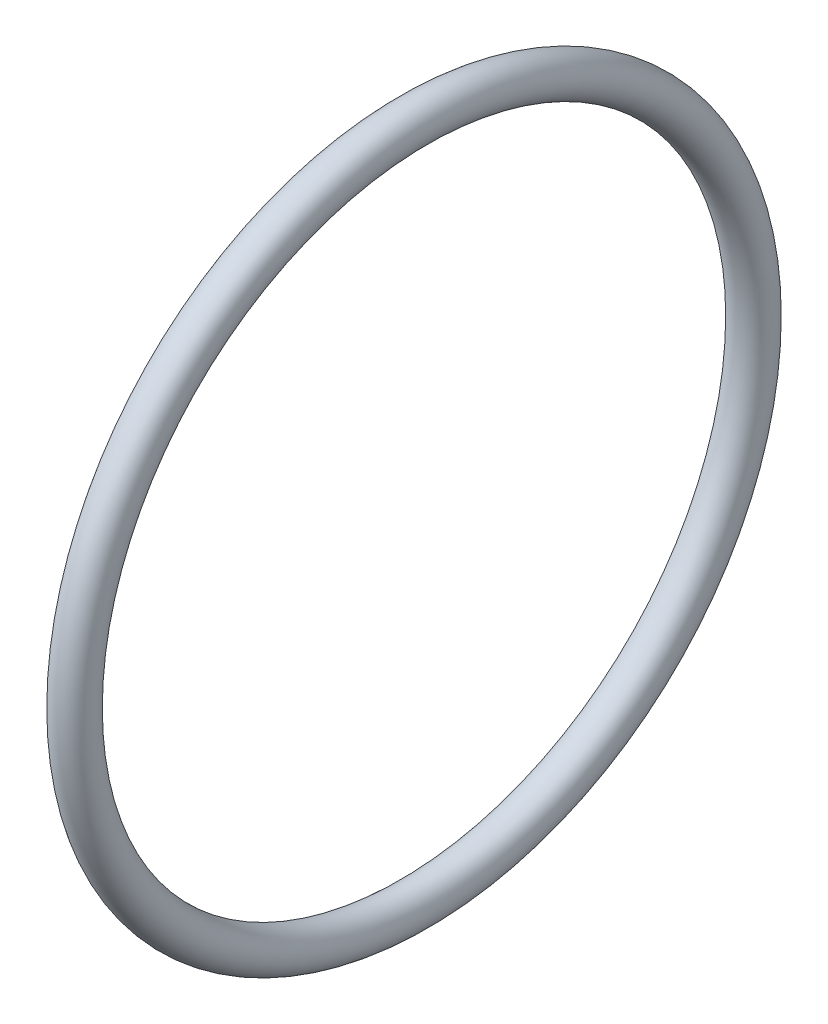
ISO-10303-21;
HEADER;
FILE_DESCRIPTION(('STEP AP214'),'2;1');
FILE_NAME('part.step','',(''),(''),'','','');
FILE_SCHEMA(('AUTOMOTIVE_DESIGN { 1 0 10303 214 1 1 1 1 }'));
ENDSEC;
DATA;
#1=APPLICATION_CONTEXT('core data for automotive mechanical design processes');
#2=APPLICATION_PROTOCOL_DEFINITION('international standard','automotive_design',2000,#1);
#3=PRODUCT_CONTEXT('',#1,'mechanical');
#4=PRODUCT('Part','Part','',(#3));
#5=PRODUCT_RELATED_PRODUCT_CATEGORY('part','',(#4));
#6=PRODUCT_DEFINITION_FORMATION('','',#4);
#7=PRODUCT_DEFINITION_CONTEXT('part definition',#1,'design');
#8=PRODUCT_DEFINITION('design','',#6,#7);
#9=PRODUCT_DEFINITION_SHAPE('','',#8);
#10=(LENGTH_UNIT() NAMED_UNIT(*) SI_UNIT(.MILLI.,.METRE.));
#11=(NAMED_UNIT(*) PLANE_ANGLE_UNIT() SI_UNIT($,.RADIAN.));
#12=(NAMED_UNIT(*) SI_UNIT($,.STERADIAN.) SOLID_ANGLE_UNIT());
#13=UNCERTAINTY_MEASURE_WITH_UNIT(LENGTH_MEASURE(1.E-05),#10,'distance_accuracy_value','');
#14=(GEOMETRIC_REPRESENTATION_CONTEXT(3) GLOBAL_UNCERTAINTY_ASSIGNED_CONTEXT((#13)) GLOBAL_UNIT_ASSIGNED_CONTEXT((#10,
#11,#12)) REPRESENTATION_CONTEXT('',''));
#15=CARTESIAN_POINT('',(0.,0.,0.));
#16=DIRECTION('',(0.,0.,1.));
#17=DIRECTION('',(1.,0.,0.));
#18=AXIS2_PLACEMENT_3D('',#15,#16,#17);
#19=CARTESIAN_POINT('',(0.,0.,0.));
#20=DIRECTION('',(-1.,0.,0.));
#21=DIRECTION('',(0.,0.,1.));
#22=AXIS2_PLACEMENT_3D('',#19,#20,#21);
#23=TOROIDAL_SURFACE('',#22,17.275,1.);
#24=CARTESIAN_POINT('',(0.,0.,18.275));
#25=VERTEX_POINT('',#24);
#26=VERTEX_LOOP('',#25);
#27=FACE_BOUND('',#26,.T.);
#28=ADVANCED_FACE('F28',(#27),#23,.T.);
#29=CLOSED_SHELL('',(#28));
#30=MANIFOLD_SOLID_BREP('B2',#29);
#31=ADVANCED_BREP_SHAPE_REPRESENTATION('',(#18,#30),#14);
#32=SHAPE_DEFINITION_REPRESENTATION(#9,#31);
ENDSEC;
END-ISO-10303-21;
